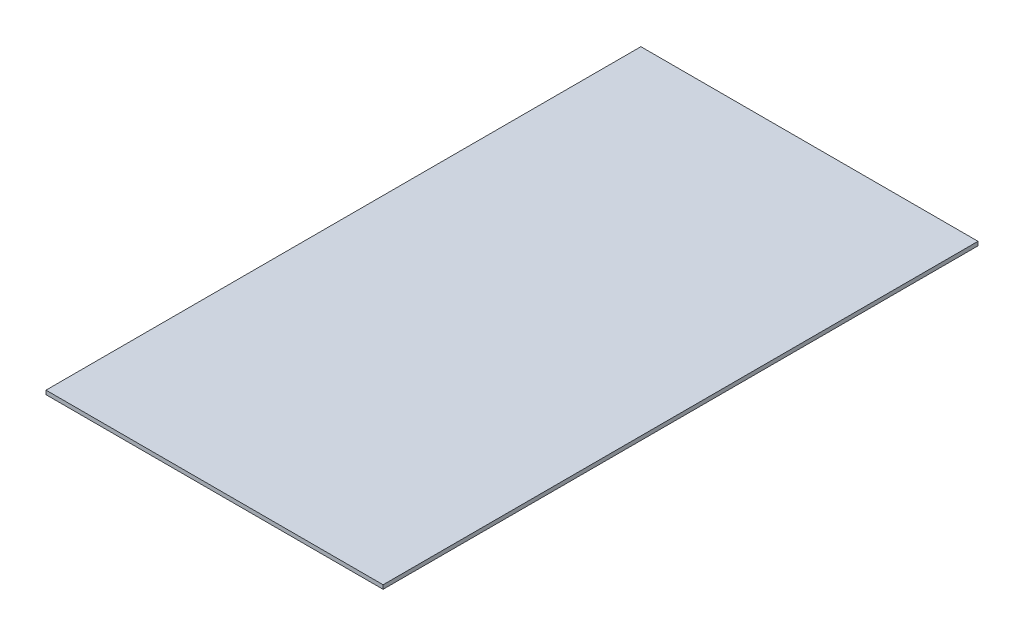
ISO-10303-21;
HEADER;
FILE_DESCRIPTION(('STEP AP214'),'2;1');
FILE_NAME('part.step','',(''),(''),'','','');
FILE_SCHEMA(('AUTOMOTIVE_DESIGN { 1 0 10303 214 1 1 1 1 }'));
ENDSEC;
DATA;
#1=APPLICATION_CONTEXT('core data for automotive mechanical design processes');
#2=APPLICATION_PROTOCOL_DEFINITION('international standard','automotive_design',2000,#1);
#3=PRODUCT_CONTEXT('',#1,'mechanical');
#4=PRODUCT('Part','Part','',(#3));
#5=PRODUCT_RELATED_PRODUCT_CATEGORY('part','',(#4));
#6=PRODUCT_DEFINITION_FORMATION('','',#4);
#7=PRODUCT_DEFINITION_CONTEXT('part definition',#1,'design');
#8=PRODUCT_DEFINITION('design','',#6,#7);
#9=PRODUCT_DEFINITION_SHAPE('','',#8);
#10=(LENGTH_UNIT() NAMED_UNIT(*) SI_UNIT(.MILLI.,.METRE.));
#11=(NAMED_UNIT(*) PLANE_ANGLE_UNIT() SI_UNIT($,.RADIAN.));
#12=(NAMED_UNIT(*) SI_UNIT($,.STERADIAN.) SOLID_ANGLE_UNIT());
#13=UNCERTAINTY_MEASURE_WITH_UNIT(LENGTH_MEASURE(1.E-05),#10,'distance_accuracy_value','');
#14=(GEOMETRIC_REPRESENTATION_CONTEXT(3) GLOBAL_UNCERTAINTY_ASSIGNED_CONTEXT((#13)) GLOBAL_UNIT_ASSIGNED_CONTEXT((#10,
#11,#12)) REPRESENTATION_CONTEXT('',''));
#15=CARTESIAN_POINT('',(0.,0.,0.));
#16=DIRECTION('',(0.,0.,1.));
#17=DIRECTION('',(1.,0.,0.));
#18=AXIS2_PLACEMENT_3D('',#15,#16,#17);
#19=CARTESIAN_POINT('',(-8.,10.,0.));
#20=DIRECTION('',(-1.,0.,0.));
#21=DIRECTION('',(0.,0.,1.));
#22=AXIS2_PLACEMENT_3D('',#19,#20,#21);
#23=PLANE('',#22);
#24=DIRECTION('',(0.,1.,0.));
#25=VECTOR('',#24,1.);
#26=CARTESIAN_POINT('',(-8.,10.,55.));
#27=LINE('',#26,#25);
#28=CARTESIAN_POINT('',(-8.,10.,55.));
#29=VERTEX_POINT('',#28);
#30=CARTESIAN_POINT('',(-8.,10.2,55.));
#31=VERTEX_POINT('',#30);
#32=EDGE_CURVE('E11',#29,#31,#27,.T.);
#33=ORIENTED_EDGE('',*,*,#32,.F.);
#34=DIRECTION('',(0.,0.,1.));
#35=VECTOR('',#34,1.);
#36=CARTESIAN_POINT('',(-8.,10.,0.));
#37=LINE('',#36,#35);
#38=CARTESIAN_POINT('',(-7.99999999999999,10.,25.));
#39=VERTEX_POINT('',#38);
#40=EDGE_CURVE('E88',#29,#39,#37,.F.);
#41=ORIENTED_EDGE('',*,*,#40,.T.);
#42=DIRECTION('',(0.,1.,0.));
#43=VECTOR('',#42,1.);
#44=CARTESIAN_POINT('',(-7.99999999999999,10.,25.));
#45=LINE('',#44,#43);
#46=CARTESIAN_POINT('',(-7.99999999999999,10.2,25.));
#47=VERTEX_POINT('',#46);
#48=EDGE_CURVE('E43',#39,#47,#45,.T.);
#49=ORIENTED_EDGE('',*,*,#48,.T.);
#50=DIRECTION('',(0.,0.,1.));
#51=VECTOR('',#50,1.);
#52=CARTESIAN_POINT('',(-8.,10.2,0.));
#53=LINE('',#52,#51);
#54=EDGE_CURVE('E101',#31,#47,#53,.F.);
#55=ORIENTED_EDGE('',*,*,#54,.F.);
#56=EDGE_LOOP('',(#33,#41,#49,#55));
#57=FACE_BOUND('',#56,.T.);
#58=ADVANCED_FACE('F33',(#57),#23,.F.);
#59=CARTESIAN_POINT('',(0.,10.,25.));
#60=DIRECTION('',(0.,0.,1.));
#61=DIRECTION('',(1.,0.,0.));
#62=AXIS2_PLACEMENT_3D('',#59,#60,#61);
#63=PLANE('',#62);
#64=ORIENTED_EDGE('',*,*,#48,.F.);
#65=DIRECTION('',(1.,0.,0.));
#66=VECTOR('',#65,1.);
#67=CARTESIAN_POINT('',(0.,10.,25.));
#68=LINE('',#67,#66);
#69=CARTESIAN_POINT('',(-25.,10.,25.));
#70=VERTEX_POINT('',#69);
#71=EDGE_CURVE('E95',#70,#39,#68,.T.);
#72=ORIENTED_EDGE('',*,*,#71,.F.);
#73=DIRECTION('',(0.,1.,0.));
#74=VECTOR('',#73,1.);
#75=CARTESIAN_POINT('',(-25.,10.,25.));
#76=LINE('',#75,#74);
#77=CARTESIAN_POINT('',(-25.,10.2,25.));
#78=VERTEX_POINT('',#77);
#79=EDGE_CURVE('E51',#70,#78,#76,.T.);
#80=ORIENTED_EDGE('',*,*,#79,.T.);
#81=DIRECTION('',(1.,0.,0.));
#82=VECTOR('',#81,1.);
#83=CARTESIAN_POINT('',(0.,10.2,25.));
#84=LINE('',#83,#82);
#85=EDGE_CURVE('E82',#78,#47,#84,.T.);
#86=ORIENTED_EDGE('',*,*,#85,.T.);
#87=EDGE_LOOP('',(#64,#72,#80,#86));
#88=FACE_BOUND('',#87,.T.);
#89=ADVANCED_FACE('F105',(#88),#63,.F.);
#90=CARTESIAN_POINT('',(-25.,10.,0.));
#91=DIRECTION('',(-1.,0.,0.));
#92=DIRECTION('',(0.,0.,1.));
#93=AXIS2_PLACEMENT_3D('',#90,#91,#92);
#94=PLANE('',#93);
#95=ORIENTED_EDGE('',*,*,#79,.F.);
#96=DIRECTION('',(0.,0.,1.));
#97=VECTOR('',#96,1.);
#98=CARTESIAN_POINT('',(-25.,10.,0.));
#99=LINE('',#98,#97);
#100=CARTESIAN_POINT('',(-25.,10.,55.));
#101=VERTEX_POINT('',#100);
#102=EDGE_CURVE('E87',#101,#70,#99,.F.);
#103=ORIENTED_EDGE('',*,*,#102,.F.);
#104=DIRECTION('',(0.,1.,0.));
#105=VECTOR('',#104,1.);
#106=CARTESIAN_POINT('',(-25.,10.,55.));
#107=LINE('',#106,#105);
#108=CARTESIAN_POINT('',(-25.,10.2,55.));
#109=VERTEX_POINT('',#108);
#110=EDGE_CURVE('E37',#101,#109,#107,.T.);
#111=ORIENTED_EDGE('',*,*,#110,.T.);
#112=DIRECTION('',(0.,0.,1.));
#113=VECTOR('',#112,1.);
#114=CARTESIAN_POINT('',(-25.,10.2,0.));
#115=LINE('',#114,#113);
#116=EDGE_CURVE('E97',#109,#78,#115,.F.);
#117=ORIENTED_EDGE('',*,*,#116,.T.);
#118=EDGE_LOOP('',(#95,#103,#111,#117));
#119=FACE_BOUND('',#118,.T.);
#120=ADVANCED_FACE('F90',(#119),#94,.T.);
#121=CARTESIAN_POINT('',(0.,10.,55.));
#122=DIRECTION('',(0.,0.,1.));
#123=DIRECTION('',(1.,0.,0.));
#124=AXIS2_PLACEMENT_3D('',#121,#122,#123);
#125=PLANE('',#124);
#126=DIRECTION('',(1.,0.,0.));
#127=VECTOR('',#126,1.);
#128=CARTESIAN_POINT('',(0.,10.,55.));
#129=LINE('',#128,#127);
#130=EDGE_CURVE('E76',#101,#29,#129,.T.);
#131=ORIENTED_EDGE('',*,*,#130,.T.);
#132=ORIENTED_EDGE('',*,*,#32,.T.);
#133=DIRECTION('',(1.,0.,0.));
#134=VECTOR('',#133,1.);
#135=CARTESIAN_POINT('',(0.,10.2,55.));
#136=LINE('',#135,#134);
#137=EDGE_CURVE('E78',#109,#31,#136,.T.);
#138=ORIENTED_EDGE('',*,*,#137,.F.);
#139=ORIENTED_EDGE('',*,*,#110,.F.);
#140=EDGE_LOOP('',(#131,#132,#138,#139));
#141=FACE_BOUND('',#140,.T.);
#142=ADVANCED_FACE('F35',(#141),#125,.T.);
#143=CARTESIAN_POINT('',(0.,10.2,0.));
#144=DIRECTION('',(0.,1.,0.));
#145=DIRECTION('',(0.,0.,1.));
#146=AXIS2_PLACEMENT_3D('',#143,#144,#145);
#147=PLANE('',#146);
#148=ORIENTED_EDGE('',*,*,#116,.F.);
#149=ORIENTED_EDGE('',*,*,#137,.T.);
#150=ORIENTED_EDGE('',*,*,#54,.T.);
#151=ORIENTED_EDGE('',*,*,#85,.F.);
#152=EDGE_LOOP('',(#148,#149,#150,#151));
#153=FACE_BOUND('',#152,.T.);
#154=ADVANCED_FACE('F104',(#153),#147,.T.);
#155=CARTESIAN_POINT('',(0.,10.,0.));
#156=DIRECTION('',(0.,1.,0.));
#157=DIRECTION('',(0.,0.,1.));
#158=AXIS2_PLACEMENT_3D('',#155,#156,#157);
#159=PLANE('',#158);
#160=ORIENTED_EDGE('',*,*,#102,.T.);
#161=ORIENTED_EDGE('',*,*,#71,.T.);
#162=ORIENTED_EDGE('',*,*,#40,.F.);
#163=ORIENTED_EDGE('',*,*,#130,.F.);
#164=EDGE_LOOP('',(#160,#161,#162,#163));
#165=FACE_BOUND('',#164,.T.);
#166=ADVANCED_FACE('F85',(#165),#159,.F.);
#167=CLOSED_SHELL('',(#58,#89,#120,#142,#154,#166));
#168=MANIFOLD_SOLID_BREP('B2',#167);
#169=ADVANCED_BREP_SHAPE_REPRESENTATION('',(#18,#168),#14);
#170=SHAPE_DEFINITION_REPRESENTATION(#9,#169);
ENDSEC;
END-ISO-10303-21;
